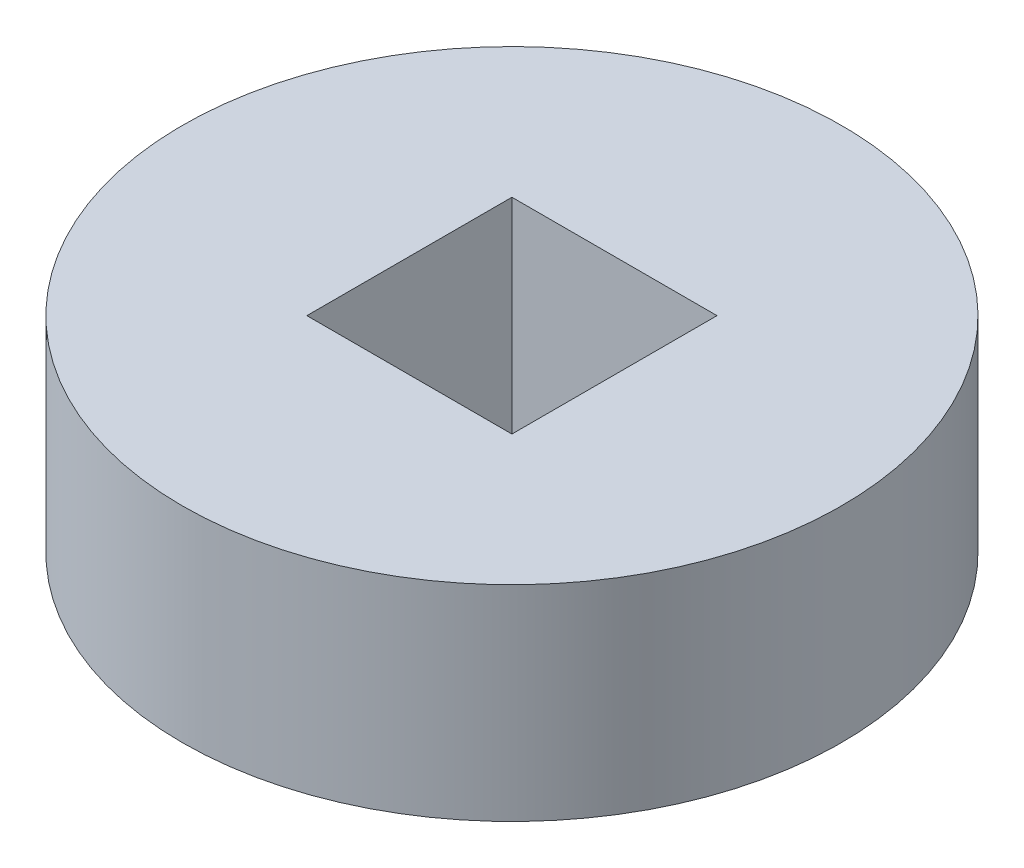
ISO-10303-21;
HEADER;
FILE_DESCRIPTION(('STEP AP214'),'2;1');
FILE_NAME('part.step','',(''),(''),'','','');
FILE_SCHEMA(('AUTOMOTIVE_DESIGN { 1 0 10303 214 1 1 1 1 }'));
ENDSEC;
DATA;
#1=APPLICATION_CONTEXT('core data for automotive mechanical design processes');
#2=APPLICATION_PROTOCOL_DEFINITION('international standard','automotive_design',2000,#1);
#3=PRODUCT_CONTEXT('',#1,'mechanical');
#4=PRODUCT('Part','Part','',(#3));
#5=PRODUCT_RELATED_PRODUCT_CATEGORY('part','',(#4));
#6=PRODUCT_DEFINITION_FORMATION('','',#4);
#7=PRODUCT_DEFINITION_CONTEXT('part definition',#1,'design');
#8=PRODUCT_DEFINITION('design','',#6,#7);
#9=PRODUCT_DEFINITION_SHAPE('','',#8);
#10=(LENGTH_UNIT() NAMED_UNIT(*) SI_UNIT(.MILLI.,.METRE.));
#11=(NAMED_UNIT(*) PLANE_ANGLE_UNIT() SI_UNIT($,.RADIAN.));
#12=(NAMED_UNIT(*) SI_UNIT($,.STERADIAN.) SOLID_ANGLE_UNIT());
#13=UNCERTAINTY_MEASURE_WITH_UNIT(LENGTH_MEASURE(1.E-05),#10,'distance_accuracy_value','');
#14=(GEOMETRIC_REPRESENTATION_CONTEXT(3) GLOBAL_UNCERTAINTY_ASSIGNED_CONTEXT((#13)) GLOBAL_UNIT_ASSIGNED_CONTEXT((#10,
#11,#12)) REPRESENTATION_CONTEXT('',''));
#15=CARTESIAN_POINT('',(0.,0.,0.));
#16=DIRECTION('',(0.,0.,1.));
#17=DIRECTION('',(1.,0.,0.));
#18=AXIS2_PLACEMENT_3D('',#15,#16,#17);
#19=CARTESIAN_POINT('',(0.,6.35,0.));
#20=DIRECTION('',(0.,1.,0.));
#21=DIRECTION('',(0.,0.,1.));
#22=AXIS2_PLACEMENT_3D('',#19,#20,#21);
#23=PLANE('',#22);
#24=CARTESIAN_POINT('',(0.,6.35,0.));
#25=DIRECTION('',(0.,1.,0.));
#26=DIRECTION('',(0.,0.,1.));
#27=AXIS2_PLACEMENT_3D('',#24,#25,#26);
#28=CIRCLE('',#27,10.2051280605346);
#29=CARTESIAN_POINT('',(0.,6.35,10.2051280605346));
#30=VERTEX_POINT('',#29);
#31=EDGE_CURVE('E11',#30,#30,#28,.T.);
#32=ORIENTED_EDGE('',*,*,#31,.T.);
#33=EDGE_LOOP('',(#32));
#34=FACE_BOUND('',#33,.T.);
#35=DIRECTION('',(-1.,0.,0.));
#36=VECTOR('',#35,1.);
#37=CARTESIAN_POINT('',(-3.175,6.35,-3.175));
#38=LINE('',#37,#36);
#39=CARTESIAN_POINT('',(3.175,6.35,-3.175));
#40=VERTEX_POINT('',#39);
#41=CARTESIAN_POINT('',(-3.175,6.35,-3.175));
#42=VERTEX_POINT('',#41);
#43=EDGE_CURVE('E82',#40,#42,#38,.T.);
#44=ORIENTED_EDGE('',*,*,#43,.F.);
#45=DIRECTION('',(0.,0.,-1.));
#46=VECTOR('',#45,1.);
#47=CARTESIAN_POINT('',(3.175,6.35,-3.175));
#48=LINE('',#47,#46);
#49=CARTESIAN_POINT('',(3.175,6.35,3.175));
#50=VERTEX_POINT('',#49);
#51=EDGE_CURVE('E74',#50,#40,#48,.T.);
#52=ORIENTED_EDGE('',*,*,#51,.F.);
#53=DIRECTION('',(1.,0.,0.));
#54=VECTOR('',#53,1.);
#55=CARTESIAN_POINT('',(-3.175,6.35,3.175));
#56=LINE('',#55,#54);
#57=CARTESIAN_POINT('',(-3.175,6.35,3.175));
#58=VERTEX_POINT('',#57);
#59=EDGE_CURVE('E95',#58,#50,#56,.T.);
#60=ORIENTED_EDGE('',*,*,#59,.F.);
#61=DIRECTION('',(0.,0.,1.));
#62=VECTOR('',#61,1.);
#63=CARTESIAN_POINT('',(-3.175,6.35,-3.175));
#64=LINE('',#63,#62);
#65=EDGE_CURVE('E93',#42,#58,#64,.T.);
#66=ORIENTED_EDGE('',*,*,#65,.F.);
#67=EDGE_LOOP('',(#44,#52,#60,#66));
#68=FACE_BOUND('',#67,.T.);
#69=ADVANCED_FACE('F33',(#34,#68),#23,.T.);
#70=CARTESIAN_POINT('',(0.,0.,0.));
#71=DIRECTION('',(0.,1.,0.));
#72=DIRECTION('',(0.,0.,1.));
#73=AXIS2_PLACEMENT_3D('',#70,#71,#72);
#74=PLANE('',#73);
#75=CARTESIAN_POINT('',(0.,0.,0.));
#76=DIRECTION('',(0.,1.,0.));
#77=DIRECTION('',(0.,0.,1.));
#78=AXIS2_PLACEMENT_3D('',#75,#76,#77);
#79=CIRCLE('',#78,10.2051280605346);
#80=CARTESIAN_POINT('',(0.,0.,10.2051280605346));
#81=VERTEX_POINT('',#80);
#82=EDGE_CURVE('E37',#81,#81,#79,.T.);
#83=ORIENTED_EDGE('',*,*,#82,.F.);
#84=EDGE_LOOP('',(#83));
#85=FACE_BOUND('',#84,.T.);
#86=DIRECTION('',(0.,0.,-1.));
#87=VECTOR('',#86,1.);
#88=CARTESIAN_POINT('',(3.175,0.,-3.175));
#89=LINE('',#88,#87);
#90=CARTESIAN_POINT('',(3.175,0.,3.175));
#91=VERTEX_POINT('',#90);
#92=CARTESIAN_POINT('',(3.175,0.,-3.175));
#93=VERTEX_POINT('',#92);
#94=EDGE_CURVE('E56',#91,#93,#89,.T.);
#95=ORIENTED_EDGE('',*,*,#94,.T.);
#96=DIRECTION('',(-1.,0.,0.));
#97=VECTOR('',#96,1.);
#98=CARTESIAN_POINT('',(-3.175,0.,-3.175));
#99=LINE('',#98,#97);
#100=CARTESIAN_POINT('',(-3.175,0.,-3.175));
#101=VERTEX_POINT('',#100);
#102=EDGE_CURVE('E89',#93,#101,#99,.T.);
#103=ORIENTED_EDGE('',*,*,#102,.T.);
#104=DIRECTION('',(0.,0.,1.));
#105=VECTOR('',#104,1.);
#106=CARTESIAN_POINT('',(-3.175,0.,-3.175));
#107=LINE('',#106,#105);
#108=CARTESIAN_POINT('',(-3.175,0.,3.175));
#109=VERTEX_POINT('',#108);
#110=EDGE_CURVE('E101',#101,#109,#107,.T.);
#111=ORIENTED_EDGE('',*,*,#110,.T.);
#112=DIRECTION('',(1.,0.,0.));
#113=VECTOR('',#112,1.);
#114=CARTESIAN_POINT('',(-3.175,0.,3.175));
#115=LINE('',#114,#113);
#116=EDGE_CURVE('E83',#109,#91,#115,.T.);
#117=ORIENTED_EDGE('',*,*,#116,.T.);
#118=EDGE_LOOP('',(#95,#103,#111,#117));
#119=FACE_BOUND('',#118,.T.);
#120=ADVANCED_FACE('F112',(#85,#119),#74,.F.);
#121=CARTESIAN_POINT('',(0.,6.35,0.));
#122=DIRECTION('',(0.,-1.,0.));
#123=DIRECTION('',(0.,0.,-1.));
#124=AXIS2_PLACEMENT_3D('',#121,#122,#123);
#125=CYLINDRICAL_SURFACE('',#124,10.2051280605346);
#126=ORIENTED_EDGE('',*,*,#31,.F.);
#127=EDGE_LOOP('',(#126));
#128=FACE_BOUND('',#127,.T.);
#129=ORIENTED_EDGE('',*,*,#82,.T.);
#130=EDGE_LOOP('',(#129));
#131=FACE_BOUND('',#130,.T.);
#132=ADVANCED_FACE('F35',(#128,#131),#125,.T.);
#133=CARTESIAN_POINT('',(3.175,6.35,-3.175));
#134=DIRECTION('',(-1.,0.,0.));
#135=DIRECTION('',(0.,0.,1.));
#136=AXIS2_PLACEMENT_3D('',#133,#134,#135);
#137=PLANE('',#136);
#138=ORIENTED_EDGE('',*,*,#94,.F.);
#139=DIRECTION('',(0.,-1.,0.));
#140=VECTOR('',#139,1.);
#141=CARTESIAN_POINT('',(3.175,6.35,3.175));
#142=LINE('',#141,#140);
#143=EDGE_CURVE('E78',#50,#91,#142,.T.);
#144=ORIENTED_EDGE('',*,*,#143,.F.);
#145=ORIENTED_EDGE('',*,*,#51,.T.);
#146=DIRECTION('',(0.,-1.,0.));
#147=VECTOR('',#146,1.);
#148=CARTESIAN_POINT('',(3.175,6.35,-3.175));
#149=LINE('',#148,#147);
#150=EDGE_CURVE('E77',#40,#93,#149,.T.);
#151=ORIENTED_EDGE('',*,*,#150,.T.);
#152=EDGE_LOOP('',(#138,#144,#145,#151));
#153=FACE_BOUND('',#152,.T.);
#154=ADVANCED_FACE('F76',(#153),#137,.T.);
#155=CARTESIAN_POINT('',(-3.175,6.35,-3.175));
#156=DIRECTION('',(0.,0.,1.));
#157=DIRECTION('',(1.,0.,0.));
#158=AXIS2_PLACEMENT_3D('',#155,#156,#157);
#159=PLANE('',#158);
#160=ORIENTED_EDGE('',*,*,#102,.F.);
#161=ORIENTED_EDGE('',*,*,#150,.F.);
#162=ORIENTED_EDGE('',*,*,#43,.T.);
#163=DIRECTION('',(0.,-1.,0.));
#164=VECTOR('',#163,1.);
#165=CARTESIAN_POINT('',(-3.175,6.35,-3.175));
#166=LINE('',#165,#164);
#167=EDGE_CURVE('E90',#42,#101,#166,.T.);
#168=ORIENTED_EDGE('',*,*,#167,.T.);
#169=EDGE_LOOP('',(#160,#161,#162,#168));
#170=FACE_BOUND('',#169,.T.);
#171=ADVANCED_FACE('F86',(#170),#159,.T.);
#172=CARTESIAN_POINT('',(-3.175,6.35,-3.175));
#173=DIRECTION('',(1.,0.,0.));
#174=DIRECTION('',(0.,0.,-1.));
#175=AXIS2_PLACEMENT_3D('',#172,#173,#174);
#176=PLANE('',#175);
#177=ORIENTED_EDGE('',*,*,#110,.F.);
#178=ORIENTED_EDGE('',*,*,#167,.F.);
#179=ORIENTED_EDGE('',*,*,#65,.T.);
#180=DIRECTION('',(0.,-1.,0.));
#181=VECTOR('',#180,1.);
#182=CARTESIAN_POINT('',(-3.175,6.35,3.175));
#183=LINE('',#182,#181);
#184=EDGE_CURVE('E48',#58,#109,#183,.T.);
#185=ORIENTED_EDGE('',*,*,#184,.T.);
#186=EDGE_LOOP('',(#177,#178,#179,#185));
#187=FACE_BOUND('',#186,.T.);
#188=ADVANCED_FACE('F110',(#187),#176,.T.);
#189=CARTESIAN_POINT('',(-3.175,6.35,3.175));
#190=DIRECTION('',(0.,0.,-1.));
#191=DIRECTION('',(-1.,0.,0.));
#192=AXIS2_PLACEMENT_3D('',#189,#190,#191);
#193=PLANE('',#192);
#194=ORIENTED_EDGE('',*,*,#116,.F.);
#195=ORIENTED_EDGE('',*,*,#184,.F.);
#196=ORIENTED_EDGE('',*,*,#59,.T.);
#197=ORIENTED_EDGE('',*,*,#143,.T.);
#198=EDGE_LOOP('',(#194,#195,#196,#197));
#199=FACE_BOUND('',#198,.T.);
#200=ADVANCED_FACE('F113',(#199),#193,.T.);
#201=CLOSED_SHELL('',(#69,#120,#132,#154,#171,#188,#200));
#202=MANIFOLD_SOLID_BREP('B2',#201);
#203=ADVANCED_BREP_SHAPE_REPRESENTATION('',(#18,#202),#14);
#204=SHAPE_DEFINITION_REPRESENTATION(#9,#203);
ENDSEC;
END-ISO-10303-21;
